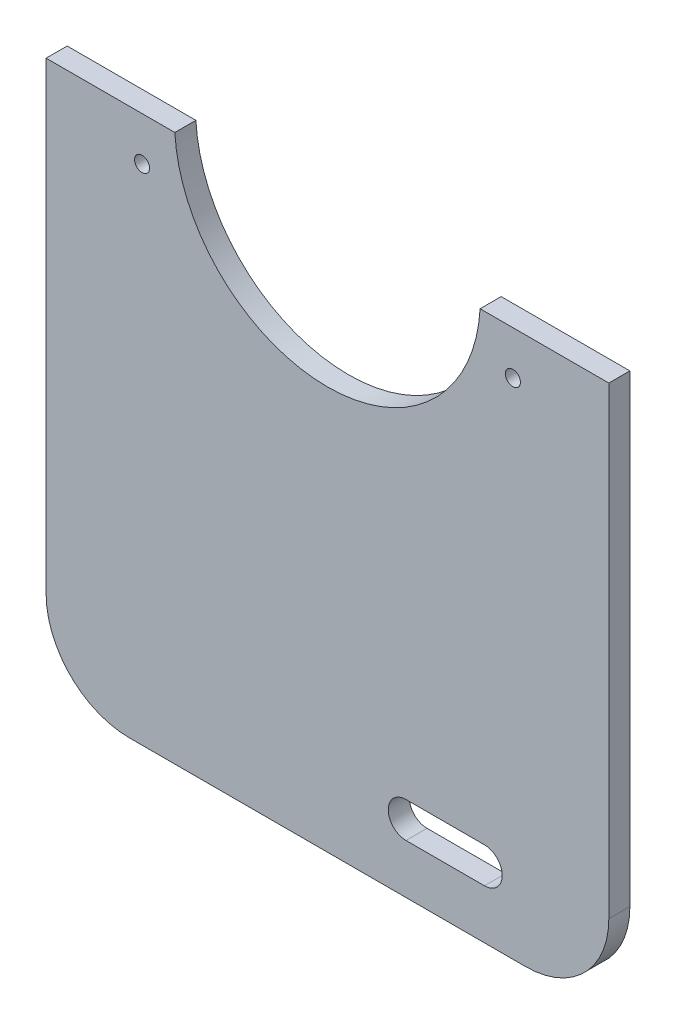
ISO-10303-21;
HEADER;
FILE_DESCRIPTION(('STEP AP214'),'2;1');
FILE_NAME('part.step','',(''),(''),'','','');
FILE_SCHEMA(('AUTOMOTIVE_DESIGN { 1 0 10303 214 1 1 1 1 }'));
ENDSEC;
DATA;
#1=APPLICATION_CONTEXT('core data for automotive mechanical design processes');
#2=APPLICATION_PROTOCOL_DEFINITION('international standard','automotive_design',2000,#1);
#3=PRODUCT_CONTEXT('',#1,'mechanical');
#4=PRODUCT('Part','Part','',(#3));
#5=PRODUCT_RELATED_PRODUCT_CATEGORY('part','',(#4));
#6=PRODUCT_DEFINITION_FORMATION('','',#4);
#7=PRODUCT_DEFINITION_CONTEXT('part definition',#1,'design');
#8=PRODUCT_DEFINITION('design','',#6,#7);
#9=PRODUCT_DEFINITION_SHAPE('','',#8);
#10=(LENGTH_UNIT() NAMED_UNIT(*) SI_UNIT(.MILLI.,.METRE.));
#11=(NAMED_UNIT(*) PLANE_ANGLE_UNIT() SI_UNIT($,.RADIAN.));
#12=(NAMED_UNIT(*) SI_UNIT($,.STERADIAN.) SOLID_ANGLE_UNIT());
#13=UNCERTAINTY_MEASURE_WITH_UNIT(LENGTH_MEASURE(1.E-05),#10,'distance_accuracy_value','');
#14=(GEOMETRIC_REPRESENTATION_CONTEXT(3) GLOBAL_UNCERTAINTY_ASSIGNED_CONTEXT((#13)) GLOBAL_UNIT_ASSIGNED_CONTEXT((#10,
#11,#12)) REPRESENTATION_CONTEXT('',''));
#15=CARTESIAN_POINT('',(0.,0.,0.));
#16=DIRECTION('',(0.,0.,1.));
#17=DIRECTION('',(1.,0.,0.));
#18=AXIS2_PLACEMENT_3D('',#15,#16,#17);
#19=CARTESIAN_POINT('',(42.5,91.85,95.3700000000007));
#20=DIRECTION('',(0.,0.,1.));
#21=DIRECTION('',(0.,-1.,0.));
#22=AXIS2_PLACEMENT_3D('',#19,#20,#21);
#23=CYLINDRICAL_SURFACE('',#22,2.0828);
#24=CARTESIAN_POINT('',(42.5,91.85,100.196000000009));
#25=DIRECTION('',(0.,0.,1.));
#26=DIRECTION('',(1.,0.,0.));
#27=AXIS2_PLACEMENT_3D('',#24,#25,#26);
#28=CIRCLE('',#27,2.0828);
#29=CARTESIAN_POINT('',(44.5828,91.85,100.196000000009));
#30=VERTEX_POINT('',#29);
#31=EDGE_CURVE('P0_E10',#30,#30,#28,.T.);
#32=ORIENTED_EDGE('',*,*,#31,.T.);
#33=EDGE_LOOP('',(#32));
#34=FACE_BOUND('',#33,.T.);
#35=CARTESIAN_POINT('',(42.5,91.85,95.3700000000007));
#36=DIRECTION('',(0.,0.,1.));
#37=DIRECTION('',(1.,0.,0.));
#38=AXIS2_PLACEMENT_3D('',#35,#36,#37);
#39=CIRCLE('',#38,2.08280000000001);
#40=CARTESIAN_POINT('',(44.5828,91.85,95.3700000000007));
#41=VERTEX_POINT('',#40);
#42=EDGE_CURVE('P0_E15',#41,#41,#39,.F.);
#43=ORIENTED_EDGE('',*,*,#42,.T.);
#44=EDGE_LOOP('',(#43));
#45=FACE_BOUND('',#44,.T.);
#46=ADVANCED_FACE('P0_F14',(#34,#45),#23,.F.);
#47=OPEN_SHELL('',(#46));
#48=SHELL_BASED_SURFACE_MODEL('P0_B1',(#47));
#49=CARTESIAN_POINT('',(-42.5,91.85,100.196000000009));
#50=DIRECTION('',(0.,0.,-1.));
#51=DIRECTION('',(0.,1.,0.));
#52=AXIS2_PLACEMENT_3D('',#49,#50,#51);
#53=CYLINDRICAL_SURFACE('',#52,2.0828);
#54=CARTESIAN_POINT('',(-42.5,91.85,100.196000000009));
#55=DIRECTION('',(0.,0.,-1.));
#56=DIRECTION('',(-1.,0.,0.));
#57=AXIS2_PLACEMENT_3D('',#54,#55,#56);
#58=CIRCLE('',#57,2.08280000000001);
#59=CARTESIAN_POINT('',(-44.5828,91.85,100.196000000009));
#60=VERTEX_POINT('',#59);
#61=EDGE_CURVE('P1_E10',#60,#60,#58,.F.);
#62=ORIENTED_EDGE('',*,*,#61,.T.);
#63=EDGE_LOOP('',(#62));
#64=FACE_BOUND('',#63,.T.);
#65=CARTESIAN_POINT('',(-42.5,91.85,95.3700000000009));
#66=DIRECTION('',(0.,0.,-1.));
#67=DIRECTION('',(-1.,0.,0.));
#68=AXIS2_PLACEMENT_3D('',#65,#66,#67);
#69=CIRCLE('',#68,2.0828);
#70=CARTESIAN_POINT('',(-44.5828,91.85,95.3700000000009));
#71=VERTEX_POINT('',#70);
#72=EDGE_CURVE('P1_E15',#71,#71,#69,.T.);
#73=ORIENTED_EDGE('',*,*,#72,.T.);
#74=EDGE_LOOP('',(#73));
#75=FACE_BOUND('',#74,.T.);
#76=ADVANCED_FACE('P1_F14',(#64,#75),#53,.F.);
#77=OPEN_SHELL('',(#76));
#78=SHELL_BASED_SURFACE_MODEL('P1_B1',(#77));
#79=CARTESIAN_POINT('',(67.08,104.358,100.196));
#80=DIRECTION('',(0.,0.,1.));
#81=DIRECTION('',(-1.,0.,0.));
#82=AXIS2_PLACEMENT_3D('',#79,#80,#81);
#83=PLANE('',#82);
#84=CARTESIAN_POINT('',(-42.5,91.85,100.196000000009));
#85=DIRECTION('',(0.,0.,-1.));
#86=DIRECTION('',(0.,1.,0.));
#87=AXIS2_PLACEMENT_3D('',#84,#85,#86);
#88=CIRCLE('',#87,1.72499999999999);
#89=CARTESIAN_POINT('',(-42.5,93.575,100.196000000009));
#90=VERTEX_POINT('',#89);
#91=EDGE_CURVE('P2_E181',#90,#90,#88,.F.);
#92=ORIENTED_EDGE('',*,*,#91,.F.);
#93=EDGE_LOOP('',(#92));
#94=FACE_BOUND('',#93,.T.);
#95=CARTESIAN_POINT('',(42.5,91.85,100.196000000009));
#96=DIRECTION('',(0.,0.,1.));
#97=DIRECTION('',(0.,-1.,0.));
#98=AXIS2_PLACEMENT_3D('',#95,#96,#97);
#99=CIRCLE('',#98,1.72499999999999);
#100=CARTESIAN_POINT('',(42.5,90.125,100.196000000009));
#101=VERTEX_POINT('',#100);
#102=EDGE_CURVE('P2_E184',#101,#101,#99,.T.);
#103=ORIENTED_EDGE('',*,*,#102,.F.);
#104=EDGE_LOOP('',(#103));
#105=FACE_BOUND('',#104,.T.);
#106=DIRECTION('',(1.,0.,0.));
#107=VECTOR('',#106,1.);
#108=CARTESIAN_POINT('',(27.,-4.085,100.196000000009));
#109=LINE('',#108,#107);
#110=CARTESIAN_POINT('',(18.,-4.085,100.196000000009));
#111=VERTEX_POINT('',#110);
#112=CARTESIAN_POINT('',(35.9999999999994,-4.085,100.196000000009));
#113=VERTEX_POINT('',#112);
#114=EDGE_CURVE('P2_E131',#111,#113,#109,.T.);
#115=ORIENTED_EDGE('',*,*,#114,.T.);
#116=CARTESIAN_POINT('',(36.,-8.15000000000001,100.196000000009));
#117=DIRECTION('',(0.,0.,1.));
#118=DIRECTION('',(0.,-1.,0.));
#119=AXIS2_PLACEMENT_3D('',#116,#117,#118);
#120=CIRCLE('',#119,4.065);
#121=CARTESIAN_POINT('',(36.0000000000002,-12.215,100.196000000009));
#122=VERTEX_POINT('',#121);
#123=EDGE_CURVE('P2_E187',#122,#113,#120,.T.);
#124=ORIENTED_EDGE('',*,*,#123,.F.);
#125=DIRECTION('',(-1.,0.,0.));
#126=VECTOR('',#125,1.);
#127=CARTESIAN_POINT('',(27.,-12.215,100.196000000009));
#128=LINE('',#127,#126);
#129=CARTESIAN_POINT('',(17.999999999999,-12.215,100.196000000009));
#130=VERTEX_POINT('',#129);
#131=EDGE_CURVE('P2_E136',#122,#130,#128,.T.);
#132=ORIENTED_EDGE('',*,*,#131,.T.);
#133=CARTESIAN_POINT('',(18.,-8.15000000000001,100.196000000009));
#134=DIRECTION('',(0.,0.,1.));
#135=DIRECTION('',(0.,-1.,0.));
#136=AXIS2_PLACEMENT_3D('',#133,#134,#135);
#137=CIRCLE('',#136,4.065);
#138=EDGE_CURVE('P2_E139',#111,#130,#137,.T.);
#139=ORIENTED_EDGE('',*,*,#138,.F.);
#140=EDGE_LOOP('',(#115,#124,#132,#139));
#141=FACE_BOUND('',#140,.T.);
#142=DIRECTION('',(0.,-1.,0.));
#143=VECTOR('',#142,1.);
#144=CARTESIAN_POINT('',(64.5,48.675,100.19600000001));
#145=LINE('',#144,#143);
#146=CARTESIAN_POINT('',(64.5,101.85,100.19600000001));
#147=VERTEX_POINT('',#146);
#148=CARTESIAN_POINT('',(64.5,-4.5,100.196000000009));
#149=VERTEX_POINT('',#148);
#150=EDGE_CURVE('P2_E141',#147,#149,#145,.T.);
#151=ORIENTED_EDGE('',*,*,#150,.F.);
#152=DIRECTION('',(1.,0.,0.));
#153=VECTOR('',#152,1.);
#154=CARTESIAN_POINT('',(0.,101.85,100.19600000001));
#155=LINE('',#154,#153);
#156=CARTESIAN_POINT('',(34.9911645990806,101.85,100.196000000009));
#157=VERTEX_POINT('',#156);
#158=EDGE_CURVE('P2_E147',#157,#147,#155,.T.);
#159=ORIENTED_EDGE('',*,*,#158,.F.);
#160=CARTESIAN_POINT('',(0.,103.88,100.196000000009));
#161=DIRECTION('',(0.,0.,1.));
#162=DIRECTION('',(0.,-1.,0.));
#163=AXIS2_PLACEMENT_3D('',#160,#161,#162);
#164=CIRCLE('',#163,35.05);
#165=CARTESIAN_POINT('',(-34.9911645990806,101.85,100.196000000009));
#166=VERTEX_POINT('',#165);
#167=EDGE_CURVE('P2_E20',#166,#157,#164,.T.);
#168=ORIENTED_EDGE('',*,*,#167,.F.);
#169=DIRECTION('',(1.,0.,0.));
#170=VECTOR('',#169,1.);
#171=CARTESIAN_POINT('',(0.,101.85,100.19600000001));
#172=LINE('',#171,#170);
#173=CARTESIAN_POINT('',(-64.5,101.85,100.19600000001));
#174=VERTEX_POINT('',#173);
#175=EDGE_CURVE('P2_E112',#174,#166,#172,.T.);
#176=ORIENTED_EDGE('',*,*,#175,.F.);
#177=DIRECTION('',(0.,1.,0.));
#178=VECTOR('',#177,1.);
#179=CARTESIAN_POINT('',(-64.5,48.675,100.19600000001));
#180=LINE('',#179,#178);
#181=CARTESIAN_POINT('',(-64.5,-4.5,100.196000000009));
#182=VERTEX_POINT('',#181);
#183=EDGE_CURVE('P2_E103',#182,#174,#180,.T.);
#184=ORIENTED_EDGE('',*,*,#183,.F.);
#185=CARTESIAN_POINT('',(-45.45,-4.5,100.196000000009));
#186=DIRECTION('',(0.,0.,1.));
#187=DIRECTION('',(0.,-1.,0.));
#188=AXIS2_PLACEMENT_3D('',#185,#186,#187);
#189=CIRCLE('',#188,19.05);
#190=CARTESIAN_POINT('',(-45.45,-23.55,100.196000000009));
#191=VERTEX_POINT('',#190);
#192=EDGE_CURVE('P2_E124',#182,#191,#189,.T.);
#193=ORIENTED_EDGE('',*,*,#192,.T.);
#194=DIRECTION('',(-1.,0.,0.));
#195=VECTOR('',#194,1.);
#196=CARTESIAN_POINT('',(0.,-23.55,100.19600000001));
#197=LINE('',#196,#195);
#198=CARTESIAN_POINT('',(45.450000000001,-23.55,100.196000000009));
#199=VERTEX_POINT('',#198);
#200=EDGE_CURVE('P2_E153',#199,#191,#197,.T.);
#201=ORIENTED_EDGE('',*,*,#200,.F.);
#202=CARTESIAN_POINT('',(45.45,-4.5,100.196000000009));
#203=DIRECTION('',(0.,0.,1.));
#204=DIRECTION('',(0.,-1.,0.));
#205=AXIS2_PLACEMENT_3D('',#202,#203,#204);
#206=CIRCLE('',#205,19.05);
#207=EDGE_CURVE('P2_E144',#199,#149,#206,.T.);
#208=ORIENTED_EDGE('',*,*,#207,.T.);
#209=EDGE_LOOP('',(#151,#159,#168,#176,#184,#193,#201,#208));
#210=FACE_BOUND('',#209,.T.);
#211=ADVANCED_FACE('P2_F16',(#94,#105,#141,#210),#83,.T.);
#212=CARTESIAN_POINT('',(0.,103.88,95.3700000000007));
#213=DIRECTION('',(0.,0.,1.));
#214=DIRECTION('',(0.,-1.,0.));
#215=AXIS2_PLACEMENT_3D('',#212,#213,#214);
#216=CYLINDRICAL_SURFACE('',#215,35.05);
#217=ORIENTED_EDGE('',*,*,#167,.T.);
#218=DIRECTION('',(0.,0.,1.));
#219=VECTOR('',#218,1.);
#220=CARTESIAN_POINT('',(34.99116459908,101.85,97.783000000005));
#221=LINE('',#220,#219);
#222=CARTESIAN_POINT('',(34.9911645990806,101.85,95.3700000000003));
#223=VERTEX_POINT('',#222);
#224=EDGE_CURVE('P2_E150',#223,#157,#221,.T.);
#225=ORIENTED_EDGE('',*,*,#224,.F.);
#226=CARTESIAN_POINT('',(0.,103.88,95.3700000000007));
#227=DIRECTION('',(0.,0.,1.));
#228=DIRECTION('',(0.,-1.,0.));
#229=AXIS2_PLACEMENT_3D('',#226,#227,#228);
#230=CIRCLE('',#229,35.05);
#231=CARTESIAN_POINT('',(-34.9911645990806,101.85,95.3700000000003));
#232=VERTEX_POINT('',#231);
#233=EDGE_CURVE('P2_E178',#223,#232,#230,.F.);
#234=ORIENTED_EDGE('',*,*,#233,.T.);
#235=DIRECTION('',(0.,0.,-1.));
#236=VECTOR('',#235,1.);
#237=CARTESIAN_POINT('',(-34.99116459908,101.85,97.783000000005));
#238=LINE('',#237,#236);
#239=EDGE_CURVE('P2_E117',#166,#232,#238,.T.);
#240=ORIENTED_EDGE('',*,*,#239,.F.);
#241=EDGE_LOOP('',(#217,#225,#234,#240));
#242=FACE_BOUND('',#241,.T.);
#243=ADVANCED_FACE('P2_F281',(#242),#216,.F.);
#244=CARTESIAN_POINT('',(67.08,101.85,95.15403516861));
#245=DIRECTION('',(0.,1.,0.));
#246=DIRECTION('',(-1.,0.,0.));
#247=AXIS2_PLACEMENT_3D('',#244,#245,#246);
#248=PLANE('',#247);
#249=DIRECTION('',(0.,0.,-1.));
#250=VECTOR('',#249,1.);
#251=CARTESIAN_POINT('',(-64.5,101.85,97.783000000005));
#252=LINE('',#251,#250);
#253=CARTESIAN_POINT('',(-64.5,101.85,95.37));
#254=VERTEX_POINT('',#253);
#255=EDGE_CURVE('P2_E107',#174,#254,#252,.T.);
#256=ORIENTED_EDGE('',*,*,#255,.F.);
#257=ORIENTED_EDGE('',*,*,#175,.T.);
#258=ORIENTED_EDGE('',*,*,#239,.T.);
#259=DIRECTION('',(-1.,0.,0.));
#260=VECTOR('',#259,1.);
#261=CARTESIAN_POINT('',(0.,101.85,95.37));
#262=LINE('',#261,#260);
#263=EDGE_CURVE('P2_E122',#232,#254,#262,.T.);
#264=ORIENTED_EDGE('',*,*,#263,.T.);
#265=EDGE_LOOP('',(#256,#257,#258,#264));
#266=FACE_BOUND('',#265,.T.);
#267=ADVANCED_FACE('P2_F120',(#266),#248,.T.);
#268=CARTESIAN_POINT('',(-64.5,103.977,95.15403516861));
#269=DIRECTION('',(-1.,0.,0.));
#270=DIRECTION('',(0.,-1.,0.));
#271=AXIS2_PLACEMENT_3D('',#268,#269,#270);
#272=PLANE('',#271);
#273=ORIENTED_EDGE('',*,*,#183,.T.);
#274=ORIENTED_EDGE('',*,*,#255,.T.);
#275=DIRECTION('',(0.,-1.,0.));
#276=VECTOR('',#275,1.);
#277=CARTESIAN_POINT('',(-64.5,39.15,95.37));
#278=LINE('',#277,#276);
#279=CARTESIAN_POINT('',(-64.5,-4.5,95.3700000000003));
#280=VERTEX_POINT('',#279);
#281=EDGE_CURVE('P2_E177',#254,#280,#278,.T.);
#282=ORIENTED_EDGE('',*,*,#281,.T.);
#283=DIRECTION('',(0.,0.,1.));
#284=VECTOR('',#283,1.);
#285=CARTESIAN_POINT('',(-64.5,-4.5,97.783000000005));
#286=LINE('',#285,#284);
#287=EDGE_CURVE('P2_E109',#280,#182,#286,.T.);
#288=ORIENTED_EDGE('',*,*,#287,.T.);
#289=EDGE_LOOP('',(#273,#274,#282,#288));
#290=FACE_BOUND('',#289,.T.);
#291=ADVANCED_FACE('P2_F104',(#290),#272,.T.);
#292=CARTESIAN_POINT('',(-45.45,-4.5,95.3700000000007));
#293=DIRECTION('',(0.,0.,1.));
#294=DIRECTION('',(0.,-1.,0.));
#295=AXIS2_PLACEMENT_3D('',#292,#293,#294);
#296=CYLINDRICAL_SURFACE('',#295,19.05);
#297=ORIENTED_EDGE('',*,*,#192,.F.);
#298=ORIENTED_EDGE('',*,*,#287,.F.);
#299=CARTESIAN_POINT('',(-45.45,-4.5,95.3700000000007));
#300=DIRECTION('',(0.,0.,1.));
#301=DIRECTION('',(0.,-1.,0.));
#302=AXIS2_PLACEMENT_3D('',#299,#300,#301);
#303=CIRCLE('',#302,19.05);
#304=CARTESIAN_POINT('',(-45.45,-23.55,95.3700000000003));
#305=VERTEX_POINT('',#304);
#306=EDGE_CURVE('P2_E174',#280,#305,#303,.T.);
#307=ORIENTED_EDGE('',*,*,#306,.T.);
#308=DIRECTION('',(0.,0.,-1.));
#309=VECTOR('',#308,1.);
#310=CARTESIAN_POINT('',(-45.45,-23.55,97.783000000005));
#311=LINE('',#310,#309);
#312=EDGE_CURVE('P2_E154',#191,#305,#311,.T.);
#313=ORIENTED_EDGE('',*,*,#312,.F.);
#314=EDGE_LOOP('',(#297,#298,#307,#313));
#315=FACE_BOUND('',#314,.T.);
#316=ADVANCED_FACE('P2_F196',(#315),#296,.T.);
#317=CARTESIAN_POINT('',(-47.268,-23.55,95.15403516861));
#318=DIRECTION('',(0.,-1.,0.));
#319=DIRECTION('',(1.,0.,0.));
#320=AXIS2_PLACEMENT_3D('',#317,#318,#319);
#321=PLANE('',#320);
#322=ORIENTED_EDGE('',*,*,#200,.T.);
#323=ORIENTED_EDGE('',*,*,#312,.T.);
#324=DIRECTION('',(1.,0.,0.));
#325=VECTOR('',#324,1.);
#326=CARTESIAN_POINT('',(0.,-23.55,95.37));
#327=LINE('',#326,#325);
#328=CARTESIAN_POINT('',(45.450000000001,-23.55,95.3700000000003));
#329=VERTEX_POINT('',#328);
#330=EDGE_CURVE('P2_E173',#305,#329,#327,.T.);
#331=ORIENTED_EDGE('',*,*,#330,.T.);
#332=DIRECTION('',(0.,0.,1.));
#333=VECTOR('',#332,1.);
#334=CARTESIAN_POINT('',(45.450000000002,-23.55,97.783000000005));
#335=LINE('',#334,#333);
#336=EDGE_CURVE('P2_E192',#329,#199,#335,.T.);
#337=ORIENTED_EDGE('',*,*,#336,.T.);
#338=EDGE_LOOP('',(#322,#323,#331,#337));
#339=FACE_BOUND('',#338,.T.);
#340=ADVANCED_FACE('P2_F296',(#339),#321,.T.);
#341=CARTESIAN_POINT('',(45.45,-4.5,95.3700000000007));
#342=DIRECTION('',(0.,0.,1.));
#343=DIRECTION('',(0.,-1.,0.));
#344=AXIS2_PLACEMENT_3D('',#341,#342,#343);
#345=CYLINDRICAL_SURFACE('',#344,19.05);
#346=ORIENTED_EDGE('',*,*,#207,.F.);
#347=ORIENTED_EDGE('',*,*,#336,.F.);
#348=CARTESIAN_POINT('',(45.45,-4.5,95.3700000000007));
#349=DIRECTION('',(0.,0.,1.));
#350=DIRECTION('',(0.,-1.,0.));
#351=AXIS2_PLACEMENT_3D('',#348,#349,#350);
#352=CIRCLE('',#351,19.05);
#353=CARTESIAN_POINT('',(64.5,-4.5,95.3700000000003));
#354=VERTEX_POINT('',#353);
#355=EDGE_CURVE('P2_E169',#329,#354,#352,.T.);
#356=ORIENTED_EDGE('',*,*,#355,.T.);
#357=DIRECTION('',(0.,0.,-1.));
#358=VECTOR('',#357,1.);
#359=CARTESIAN_POINT('',(64.5,-4.5,97.783000000005));
#360=LINE('',#359,#358);
#361=EDGE_CURVE('P2_E143',#149,#354,#360,.T.);
#362=ORIENTED_EDGE('',*,*,#361,.F.);
#363=EDGE_LOOP('',(#346,#347,#356,#362));
#364=FACE_BOUND('',#363,.T.);
#365=ADVANCED_FACE('P2_F299',(#364),#345,.T.);
#366=CARTESIAN_POINT('',(64.5,-6.627,95.15403516861));
#367=DIRECTION('',(1.,0.,0.));
#368=DIRECTION('',(0.,1.,0.));
#369=AXIS2_PLACEMENT_3D('',#366,#367,#368);
#370=PLANE('',#369);
#371=ORIENTED_EDGE('',*,*,#150,.T.);
#372=ORIENTED_EDGE('',*,*,#361,.T.);
#373=DIRECTION('',(0.,1.,0.));
#374=VECTOR('',#373,1.);
#375=CARTESIAN_POINT('',(64.5,39.15,95.37));
#376=LINE('',#375,#374);
#377=CARTESIAN_POINT('',(64.5,101.85,95.37));
#378=VERTEX_POINT('',#377);
#379=EDGE_CURVE('P2_E172',#354,#378,#376,.T.);
#380=ORIENTED_EDGE('',*,*,#379,.T.);
#381=DIRECTION('',(0.,0.,-1.));
#382=VECTOR('',#381,1.);
#383=CARTESIAN_POINT('',(64.5,101.85,97.783000000005));
#384=LINE('',#383,#382);
#385=EDGE_CURVE('P2_E140',#147,#378,#384,.T.);
#386=ORIENTED_EDGE('',*,*,#385,.F.);
#387=EDGE_LOOP('',(#371,#372,#380,#386));
#388=FACE_BOUND('',#387,.T.);
#389=ADVANCED_FACE('P2_F300',(#388),#370,.T.);
#390=CARTESIAN_POINT('',(67.08,101.85,95.15403516861));
#391=DIRECTION('',(0.,1.,0.));
#392=DIRECTION('',(-1.,0.,0.));
#393=AXIS2_PLACEMENT_3D('',#390,#391,#392);
#394=PLANE('',#393);
#395=ORIENTED_EDGE('',*,*,#385,.T.);
#396=DIRECTION('',(-1.,0.,0.));
#397=VECTOR('',#396,1.);
#398=CARTESIAN_POINT('',(0.,101.85,95.37));
#399=LINE('',#398,#397);
#400=EDGE_CURVE('P2_E228',#378,#223,#399,.T.);
#401=ORIENTED_EDGE('',*,*,#400,.T.);
#402=ORIENTED_EDGE('',*,*,#224,.T.);
#403=ORIENTED_EDGE('',*,*,#158,.T.);
#404=EDGE_LOOP('',(#395,#401,#402,#403));
#405=FACE_BOUND('',#404,.T.);
#406=ADVANCED_FACE('P2_F303',(#405),#394,.T.);
#407=CARTESIAN_POINT('',(17.64,-12.215,95.15403516861));
#408=DIRECTION('',(0.,-1.,0.));
#409=DIRECTION('',(1.,0.,0.));
#410=AXIS2_PLACEMENT_3D('',#407,#408,#409);
#411=PLANE('',#410);
#412=ORIENTED_EDGE('',*,*,#131,.F.);
#413=DIRECTION('',(0.,0.,1.));
#414=VECTOR('',#413,1.);
#415=CARTESIAN_POINT('',(36.0000000000004,-12.215,97.783000000005));
#416=LINE('',#415,#414);
#417=CARTESIAN_POINT('',(36.0000000000002,-12.215,95.3700000000003));
#418=VERTEX_POINT('',#417);
#419=EDGE_CURVE('P2_E134',#418,#122,#416,.T.);
#420=ORIENTED_EDGE('',*,*,#419,.F.);
#421=DIRECTION('',(-1.,0.,0.));
#422=VECTOR('',#421,1.);
#423=CARTESIAN_POINT('',(0.,-12.215,95.37));
#424=LINE('',#423,#422);
#425=CARTESIAN_POINT('',(17.999999999999,-12.215,95.3700000000003));
#426=VERTEX_POINT('',#425);
#427=EDGE_CURVE('P2_E168',#418,#426,#424,.T.);
#428=ORIENTED_EDGE('',*,*,#427,.T.);
#429=DIRECTION('',(0.,0.,-1.));
#430=VECTOR('',#429,1.);
#431=CARTESIAN_POINT('',(17.999999999998,-12.215,97.783000000005));
#432=LINE('',#431,#430);
#433=EDGE_CURVE('P2_E190',#130,#426,#432,.T.);
#434=ORIENTED_EDGE('',*,*,#433,.F.);
#435=EDGE_LOOP('',(#412,#420,#428,#434));
#436=FACE_BOUND('',#435,.T.);
#437=ADVANCED_FACE('P2_F247',(#436),#411,.F.);
#438=CARTESIAN_POINT('',(18.,-8.15,95.3700000000007));
#439=DIRECTION('',(0.,0.,1.));
#440=DIRECTION('',(0.,-1.,0.));
#441=AXIS2_PLACEMENT_3D('',#438,#439,#440);
#442=CYLINDRICAL_SURFACE('',#441,4.065);
#443=ORIENTED_EDGE('',*,*,#138,.T.);
#444=ORIENTED_EDGE('',*,*,#433,.T.);
#445=CARTESIAN_POINT('',(18.,-8.15,95.3700000000007));
#446=DIRECTION('',(0.,0.,1.));
#447=DIRECTION('',(0.,-1.,0.));
#448=AXIS2_PLACEMENT_3D('',#445,#446,#447);
#449=CIRCLE('',#448,4.065);
#450=CARTESIAN_POINT('',(18.,-4.08500000000001,95.3700000000003));
#451=VERTEX_POINT('',#450);
#452=EDGE_CURVE('P2_E165',#426,#451,#449,.F.);
#453=ORIENTED_EDGE('',*,*,#452,.T.);
#454=DIRECTION('',(0.,0.,1.));
#455=VECTOR('',#454,1.);
#456=CARTESIAN_POINT('',(18.,-4.085,97.783000000005));
#457=LINE('',#456,#455);
#458=EDGE_CURVE('P2_E135',#451,#111,#457,.T.);
#459=ORIENTED_EDGE('',*,*,#458,.T.);
#460=EDGE_LOOP('',(#443,#444,#453,#459));
#461=FACE_BOUND('',#460,.T.);
#462=ADVANCED_FACE('P2_F244',(#461),#442,.F.);
#463=CARTESIAN_POINT('',(36.36,-4.085,95.15403516861));
#464=DIRECTION('',(0.,1.,0.));
#465=DIRECTION('',(-1.,0.,0.));
#466=AXIS2_PLACEMENT_3D('',#463,#464,#465);
#467=PLANE('',#466);
#468=ORIENTED_EDGE('',*,*,#114,.F.);
#469=ORIENTED_EDGE('',*,*,#458,.F.);
#470=DIRECTION('',(1.,0.,0.));
#471=VECTOR('',#470,1.);
#472=CARTESIAN_POINT('',(0.,-4.08500000000001,95.37));
#473=LINE('',#472,#471);
#474=CARTESIAN_POINT('',(35.9999999999994,-4.08500000000001,95.3700000000003));
#475=VERTEX_POINT('',#474);
#476=EDGE_CURVE('P2_E164',#451,#475,#473,.T.);
#477=ORIENTED_EDGE('',*,*,#476,.T.);
#478=DIRECTION('',(0.,0.,-1.));
#479=VECTOR('',#478,1.);
#480=CARTESIAN_POINT('',(35.9999999999987,-4.08500000000001,97.783000000005));
#481=LINE('',#480,#479);
#482=EDGE_CURVE('P2_E35',#113,#475,#481,.T.);
#483=ORIENTED_EDGE('',*,*,#482,.F.);
#484=EDGE_LOOP('',(#468,#469,#477,#483));
#485=FACE_BOUND('',#484,.T.);
#486=ADVANCED_FACE('P2_F239',(#485),#467,.F.);
#487=CARTESIAN_POINT('',(36.,-8.15,95.3700000000007));
#488=DIRECTION('',(0.,0.,1.));
#489=DIRECTION('',(0.,-1.,0.));
#490=AXIS2_PLACEMENT_3D('',#487,#488,#489);
#491=CYLINDRICAL_SURFACE('',#490,4.065);
#492=ORIENTED_EDGE('',*,*,#123,.T.);
#493=ORIENTED_EDGE('',*,*,#482,.T.);
#494=CARTESIAN_POINT('',(36.,-8.15,95.3700000000007));
#495=DIRECTION('',(0.,0.,1.));
#496=DIRECTION('',(0.,-1.,0.));
#497=AXIS2_PLACEMENT_3D('',#494,#495,#496);
#498=CIRCLE('',#497,4.065);
#499=EDGE_CURVE('P2_E162',#475,#418,#498,.F.);
#500=ORIENTED_EDGE('',*,*,#499,.T.);
#501=ORIENTED_EDGE('',*,*,#419,.T.);
#502=EDGE_LOOP('',(#492,#493,#500,#501));
#503=FACE_BOUND('',#502,.T.);
#504=ADVANCED_FACE('P2_F250',(#503),#491,.F.);
#505=CARTESIAN_POINT('',(42.5,91.85,95.3700000000007));
#506=DIRECTION('',(0.,0.,1.));
#507=DIRECTION('',(0.,-1.,0.));
#508=AXIS2_PLACEMENT_3D('',#505,#506,#507);
#509=CYLINDRICAL_SURFACE('',#508,1.72499999999999);
#510=ORIENTED_EDGE('',*,*,#102,.T.);
#511=EDGE_LOOP('',(#510));
#512=FACE_BOUND('',#511,.T.);
#513=CARTESIAN_POINT('',(42.5,91.85,95.3700000000007));
#514=DIRECTION('',(0.,0.,1.));
#515=DIRECTION('',(0.,-1.,0.));
#516=AXIS2_PLACEMENT_3D('',#513,#514,#515);
#517=CIRCLE('',#516,1.72499999999999);
#518=CARTESIAN_POINT('',(42.5,90.125,95.3700000000007));
#519=VERTEX_POINT('',#518);
#520=EDGE_CURVE('P2_E26',#519,#519,#517,.F.);
#521=ORIENTED_EDGE('',*,*,#520,.T.);
#522=EDGE_LOOP('',(#521));
#523=FACE_BOUND('',#522,.T.);
#524=ADVANCED_FACE('P2_F252',(#512,#523),#509,.F.);
#525=CARTESIAN_POINT('',(-42.5,91.85,100.196000000009));
#526=DIRECTION('',(0.,0.,-1.));
#527=DIRECTION('',(0.,1.,0.));
#528=AXIS2_PLACEMENT_3D('',#525,#526,#527);
#529=CYLINDRICAL_SURFACE('',#528,1.72499999999999);
#530=ORIENTED_EDGE('',*,*,#91,.T.);
#531=EDGE_LOOP('',(#530));
#532=FACE_BOUND('',#531,.T.);
#533=CARTESIAN_POINT('',(-42.5,91.85,95.3700000000009));
#534=DIRECTION('',(0.,0.,-1.));
#535=DIRECTION('',(0.,1.,0.));
#536=AXIS2_PLACEMENT_3D('',#533,#534,#535);
#537=CIRCLE('',#536,1.72499999999999);
#538=CARTESIAN_POINT('',(-42.5,93.575,95.3700000000009));
#539=VERTEX_POINT('',#538);
#540=EDGE_CURVE('P2_E11',#539,#539,#537,.T.);
#541=ORIENTED_EDGE('',*,*,#540,.T.);
#542=EDGE_LOOP('',(#541));
#543=FACE_BOUND('',#542,.T.);
#544=ADVANCED_FACE('P2_F259',(#532,#543),#529,.F.);
#545=CARTESIAN_POINT('',(67.08,104.358,95.37));
#546=DIRECTION('',(0.,0.,1.));
#547=DIRECTION('',(-1.,0.,0.));
#548=AXIS2_PLACEMENT_3D('',#545,#546,#547);
#549=PLANE('',#548);
#550=ORIENTED_EDGE('',*,*,#540,.F.);
#551=EDGE_LOOP('',(#550));
#552=FACE_BOUND('',#551,.T.);
#553=ORIENTED_EDGE('',*,*,#520,.F.);
#554=EDGE_LOOP('',(#553));
#555=FACE_BOUND('',#554,.T.);
#556=ORIENTED_EDGE('',*,*,#476,.F.);
#557=ORIENTED_EDGE('',*,*,#452,.F.);
#558=ORIENTED_EDGE('',*,*,#427,.F.);
#559=ORIENTED_EDGE('',*,*,#499,.F.);
#560=EDGE_LOOP('',(#556,#557,#558,#559));
#561=FACE_BOUND('',#560,.T.);
#562=ORIENTED_EDGE('',*,*,#379,.F.);
#563=ORIENTED_EDGE('',*,*,#355,.F.);
#564=ORIENTED_EDGE('',*,*,#330,.F.);
#565=ORIENTED_EDGE('',*,*,#306,.F.);
#566=ORIENTED_EDGE('',*,*,#281,.F.);
#567=ORIENTED_EDGE('',*,*,#263,.F.);
#568=ORIENTED_EDGE('',*,*,#233,.F.);
#569=ORIENTED_EDGE('',*,*,#400,.F.);
#570=EDGE_LOOP('',(#562,#563,#564,#565,#566,#567,#568,#569));
#571=FACE_BOUND('',#570,.T.);
#572=ADVANCED_FACE('P2_F18',(#552,#555,#561,#571),#549,.F.);
#573=CLOSED_SHELL('',(#211,#243,#267,#291,#316,#340,#365,#389,#406,#437,#462,#486,#504,#524,
#544,#572));
#574=MANIFOLD_SOLID_BREP('P2_B1',#573);
#575=ADVANCED_BREP_SHAPE_REPRESENTATION('',(#18,#574),#14);
#576=MANIFOLD_SURFACE_SHAPE_REPRESENTATION('',(#18,#48,#78),#14);
#577=SHAPE_REPRESENTATION('',(#18),#14);
#578=SHAPE_DEFINITION_REPRESENTATION(#9,#577);
#579=SHAPE_REPRESENTATION_RELATIONSHIP('','',#577,#575);
#580=SHAPE_REPRESENTATION_RELATIONSHIP('','',#577,#576);
ENDSEC;
END-ISO-10303-21;
